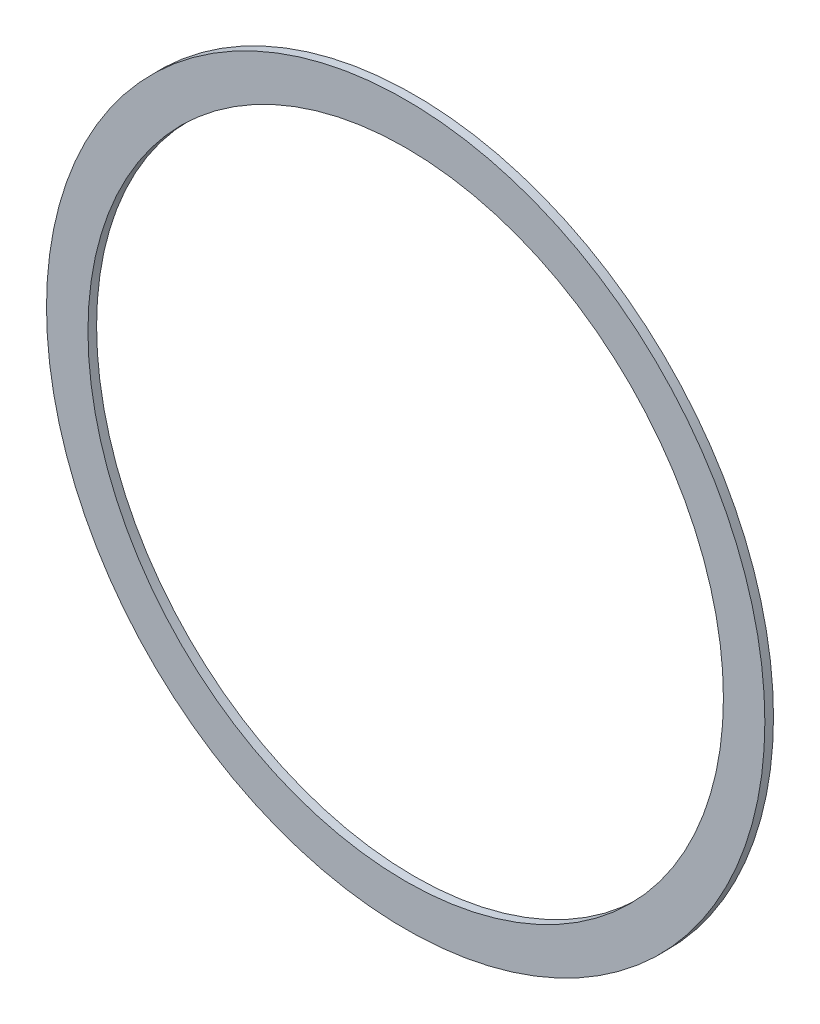
ISO-10303-21;
HEADER;
FILE_DESCRIPTION(('STEP AP214'),'2;1');
FILE_NAME('part.step','',(''),(''),'','','');
FILE_SCHEMA(('AUTOMOTIVE_DESIGN { 1 0 10303 214 1 1 1 1 }'));
ENDSEC;
DATA;
#1=APPLICATION_CONTEXT('core data for automotive mechanical design processes');
#2=APPLICATION_PROTOCOL_DEFINITION('international standard','automotive_design',2000,#1);
#3=PRODUCT_CONTEXT('',#1,'mechanical');
#4=PRODUCT('Part','Part','',(#3));
#5=PRODUCT_RELATED_PRODUCT_CATEGORY('part','',(#4));
#6=PRODUCT_DEFINITION_FORMATION('','',#4);
#7=PRODUCT_DEFINITION_CONTEXT('part definition',#1,'design');
#8=PRODUCT_DEFINITION('design','',#6,#7);
#9=PRODUCT_DEFINITION_SHAPE('','',#8);
#10=(LENGTH_UNIT() NAMED_UNIT(*) SI_UNIT(.MILLI.,.METRE.));
#11=(NAMED_UNIT(*) PLANE_ANGLE_UNIT() SI_UNIT($,.RADIAN.));
#12=(NAMED_UNIT(*) SI_UNIT($,.STERADIAN.) SOLID_ANGLE_UNIT());
#13=UNCERTAINTY_MEASURE_WITH_UNIT(LENGTH_MEASURE(1.E-05),#10,'distance_accuracy_value','');
#14=(GEOMETRIC_REPRESENTATION_CONTEXT(3) GLOBAL_UNCERTAINTY_ASSIGNED_CONTEXT((#13)) GLOBAL_UNIT_ASSIGNED_CONTEXT((#10,
#11,#12)) REPRESENTATION_CONTEXT('',''));
#15=CARTESIAN_POINT('',(0.,0.,0.));
#16=DIRECTION('',(0.,0.,1.));
#17=DIRECTION('',(1.,0.,0.));
#18=AXIS2_PLACEMENT_3D('',#15,#16,#17);
#19=CARTESIAN_POINT('',(0.,-3.556,1.5875));
#20=DIRECTION('',(0.,0.,1.));
#21=DIRECTION('',(1.,0.,0.));
#22=AXIS2_PLACEMENT_3D('',#19,#20,#21);
#23=PLANE('',#22);
#24=CARTESIAN_POINT('',(0.,-3.556,1.5875));
#25=DIRECTION('',(0.,0.,1.));
#26=DIRECTION('',(1.,0.,0.));
#27=AXIS2_PLACEMENT_3D('',#24,#25,#26);
#28=CIRCLE('',#27,132.08);
#29=CARTESIAN_POINT('',(132.08,-3.556,1.5875));
#30=VERTEX_POINT('',#29);
#31=EDGE_CURVE('E10',#30,#30,#28,.T.);
#32=ORIENTED_EDGE('',*,*,#31,.T.);
#33=EDGE_LOOP('',(#32));
#34=FACE_BOUND('',#33,.T.);
#35=CARTESIAN_POINT('',(0.,-3.556,1.5875));
#36=DIRECTION('',(0.,0.,1.));
#37=DIRECTION('',(1.,0.,0.));
#38=AXIS2_PLACEMENT_3D('',#35,#36,#37);
#39=CIRCLE('',#38,116.84);
#40=CARTESIAN_POINT('',(116.84,-3.556,1.5875));
#41=VERTEX_POINT('',#40);
#42=EDGE_CURVE('E46',#41,#41,#39,.T.);
#43=ORIENTED_EDGE('',*,*,#42,.F.);
#44=EDGE_LOOP('',(#43));
#45=FACE_BOUND('',#44,.T.);
#46=ADVANCED_FACE('F35',(#34,#45),#23,.T.);
#47=CARTESIAN_POINT('',(0.,-3.556,-1.5875));
#48=DIRECTION('',(0.,0.,1.));
#49=DIRECTION('',(1.,0.,0.));
#50=AXIS2_PLACEMENT_3D('',#47,#48,#49);
#51=PLANE('',#50);
#52=CARTESIAN_POINT('',(0.,-3.556,-1.5875));
#53=DIRECTION('',(0.,0.,1.));
#54=DIRECTION('',(1.,0.,0.));
#55=AXIS2_PLACEMENT_3D('',#52,#53,#54);
#56=CIRCLE('',#55,132.08);
#57=CARTESIAN_POINT('',(132.08,-3.556,-1.5875));
#58=VERTEX_POINT('',#57);
#59=EDGE_CURVE('E39',#58,#58,#56,.T.);
#60=ORIENTED_EDGE('',*,*,#59,.F.);
#61=EDGE_LOOP('',(#60));
#62=FACE_BOUND('',#61,.T.);
#63=CARTESIAN_POINT('',(0.,-3.556,-1.5875));
#64=DIRECTION('',(0.,0.,1.));
#65=DIRECTION('',(1.,0.,0.));
#66=AXIS2_PLACEMENT_3D('',#63,#64,#65);
#67=CIRCLE('',#66,116.84);
#68=CARTESIAN_POINT('',(116.84,-3.556,-1.5875));
#69=VERTEX_POINT('',#68);
#70=EDGE_CURVE('E48',#69,#69,#67,.T.);
#71=ORIENTED_EDGE('',*,*,#70,.T.);
#72=EDGE_LOOP('',(#71));
#73=FACE_BOUND('',#72,.T.);
#74=ADVANCED_FACE('F58',(#62,#73),#51,.F.);
#75=CARTESIAN_POINT('',(0.,-3.556,1.5875));
#76=DIRECTION('',(0.,0.,-1.));
#77=DIRECTION('',(-1.,0.,0.));
#78=AXIS2_PLACEMENT_3D('',#75,#76,#77);
#79=CYLINDRICAL_SURFACE('',#78,132.08);
#80=ORIENTED_EDGE('',*,*,#59,.T.);
#81=EDGE_LOOP('',(#80));
#82=FACE_BOUND('',#81,.T.);
#83=ORIENTED_EDGE('',*,*,#31,.F.);
#84=EDGE_LOOP('',(#83));
#85=FACE_BOUND('',#84,.T.);
#86=ADVANCED_FACE('F37',(#82,#85),#79,.T.);
#87=CARTESIAN_POINT('',(0.,-3.556,1.5875));
#88=DIRECTION('',(0.,0.,-1.));
#89=DIRECTION('',(-1.,0.,0.));
#90=AXIS2_PLACEMENT_3D('',#87,#88,#89);
#91=CYLINDRICAL_SURFACE('',#90,116.84);
#92=ORIENTED_EDGE('',*,*,#42,.T.);
#93=EDGE_LOOP('',(#92));
#94=FACE_BOUND('',#93,.T.);
#95=ORIENTED_EDGE('',*,*,#70,.F.);
#96=EDGE_LOOP('',(#95));
#97=FACE_BOUND('',#96,.T.);
#98=ADVANCED_FACE('F54',(#94,#97),#91,.F.);
#99=CLOSED_SHELL('',(#46,#74,#86,#98));
#100=MANIFOLD_SOLID_BREP('B2',#99);
#101=ADVANCED_BREP_SHAPE_REPRESENTATION('',(#18,#100),#14);
#102=SHAPE_DEFINITION_REPRESENTATION(#9,#101);
ENDSEC;
END-ISO-10303-21;
